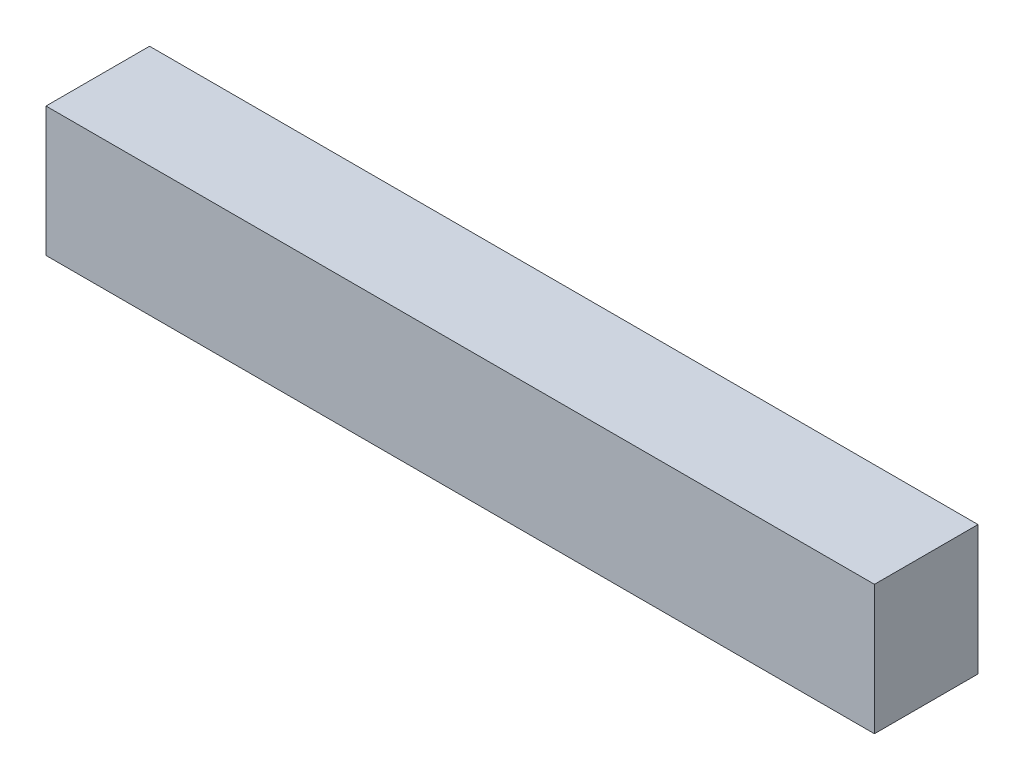
ISO-10303-21;
HEADER;
FILE_DESCRIPTION(('STEP AP214'),'2;1');
FILE_NAME('part.step','',(''),(''),'','','');
FILE_SCHEMA(('AUTOMOTIVE_DESIGN { 1 0 10303 214 1 1 1 1 }'));
ENDSEC;
DATA;
#1=APPLICATION_CONTEXT('core data for automotive mechanical design processes');
#2=APPLICATION_PROTOCOL_DEFINITION('international standard','automotive_design',2000,#1);
#3=PRODUCT_CONTEXT('',#1,'mechanical');
#4=PRODUCT('Part','Part','',(#3));
#5=PRODUCT_RELATED_PRODUCT_CATEGORY('part','',(#4));
#6=PRODUCT_DEFINITION_FORMATION('','',#4);
#7=PRODUCT_DEFINITION_CONTEXT('part definition',#1,'design');
#8=PRODUCT_DEFINITION('design','',#6,#7);
#9=PRODUCT_DEFINITION_SHAPE('','',#8);
#10=(LENGTH_UNIT() NAMED_UNIT(*) SI_UNIT(.MILLI.,.METRE.));
#11=(NAMED_UNIT(*) PLANE_ANGLE_UNIT() SI_UNIT($,.RADIAN.));
#12=(NAMED_UNIT(*) SI_UNIT($,.STERADIAN.) SOLID_ANGLE_UNIT());
#13=UNCERTAINTY_MEASURE_WITH_UNIT(LENGTH_MEASURE(1.E-05),#10,'distance_accuracy_value','');
#14=(GEOMETRIC_REPRESENTATION_CONTEXT(3) GLOBAL_UNCERTAINTY_ASSIGNED_CONTEXT((#13)) GLOBAL_UNIT_ASSIGNED_CONTEXT((#10,
#11,#12)) REPRESENTATION_CONTEXT('',''));
#15=CARTESIAN_POINT('',(0.,0.,0.));
#16=DIRECTION('',(0.,0.,1.));
#17=DIRECTION('',(1.,0.,0.));
#18=AXIS2_PLACEMENT_3D('',#15,#16,#17);
#19=CARTESIAN_POINT('',(16.,5.,2.));
#20=DIRECTION('',(-1.,0.,0.));
#21=DIRECTION('',(0.,0.,1.));
#22=AXIS2_PLACEMENT_3D('',#19,#20,#21);
#23=PLANE('',#22);
#24=DIRECTION('',(0.,0.,-1.));
#25=VECTOR('',#24,1.);
#26=CARTESIAN_POINT('',(16.,0.,2.));
#27=LINE('',#26,#25);
#28=CARTESIAN_POINT('',(16.,0.,2.));
#29=VERTEX_POINT('',#28);
#30=CARTESIAN_POINT('',(16.,0.,-2.));
#31=VERTEX_POINT('',#30);
#32=EDGE_CURVE('E96',#29,#31,#27,.T.);
#33=ORIENTED_EDGE('',*,*,#32,.T.);
#34=DIRECTION('',(0.,-1.,0.));
#35=VECTOR('',#34,1.);
#36=CARTESIAN_POINT('',(16.,5.,-2.));
#37=LINE('',#36,#35);
#38=CARTESIAN_POINT('',(16.,5.,-2.));
#39=VERTEX_POINT('',#38);
#40=EDGE_CURVE('E11',#39,#31,#37,.T.);
#41=ORIENTED_EDGE('',*,*,#40,.F.);
#42=DIRECTION('',(0.,0.,-1.));
#43=VECTOR('',#42,1.);
#44=CARTESIAN_POINT('',(16.,5.,2.));
#45=LINE('',#44,#43);
#46=CARTESIAN_POINT('',(16.,5.,2.));
#47=VERTEX_POINT('',#46);
#48=EDGE_CURVE('E84',#47,#39,#45,.T.);
#49=ORIENTED_EDGE('',*,*,#48,.F.);
#50=DIRECTION('',(0.,-1.,0.));
#51=VECTOR('',#50,1.);
#52=CARTESIAN_POINT('',(16.,5.,2.));
#53=LINE('',#52,#51);
#54=EDGE_CURVE('E92',#47,#29,#53,.T.);
#55=ORIENTED_EDGE('',*,*,#54,.T.);
#56=EDGE_LOOP('',(#33,#41,#49,#55));
#57=FACE_BOUND('',#56,.T.);
#58=ADVANCED_FACE('F33',(#57),#23,.F.);
#59=CARTESIAN_POINT('',(-16.,5.,-2.));
#60=DIRECTION('',(0.,0.,1.));
#61=DIRECTION('',(1.,0.,0.));
#62=AXIS2_PLACEMENT_3D('',#59,#60,#61);
#63=PLANE('',#62);
#64=DIRECTION('',(-1.,0.,0.));
#65=VECTOR('',#64,1.);
#66=CARTESIAN_POINT('',(-16.,0.,-2.));
#67=LINE('',#66,#65);
#68=CARTESIAN_POINT('',(-16.,0.,-2.));
#69=VERTEX_POINT('',#68);
#70=EDGE_CURVE('E88',#31,#69,#67,.T.);
#71=ORIENTED_EDGE('',*,*,#70,.T.);
#72=DIRECTION('',(0.,-1.,0.));
#73=VECTOR('',#72,1.);
#74=CARTESIAN_POINT('',(-16.,5.,-2.));
#75=LINE('',#74,#73);
#76=CARTESIAN_POINT('',(-16.,5.,-2.));
#77=VERTEX_POINT('',#76);
#78=EDGE_CURVE('E41',#77,#69,#75,.T.);
#79=ORIENTED_EDGE('',*,*,#78,.F.);
#80=DIRECTION('',(-1.,0.,0.));
#81=VECTOR('',#80,1.);
#82=CARTESIAN_POINT('',(-16.,5.,-2.));
#83=LINE('',#82,#81);
#84=EDGE_CURVE('E79',#39,#77,#83,.T.);
#85=ORIENTED_EDGE('',*,*,#84,.F.);
#86=ORIENTED_EDGE('',*,*,#40,.T.);
#87=EDGE_LOOP('',(#71,#79,#85,#86));
#88=FACE_BOUND('',#87,.T.);
#89=ADVANCED_FACE('F87',(#88),#63,.F.);
#90=CARTESIAN_POINT('',(-16.,5.,2.));
#91=DIRECTION('',(1.,0.,0.));
#92=DIRECTION('',(0.,0.,-1.));
#93=AXIS2_PLACEMENT_3D('',#90,#91,#92);
#94=PLANE('',#93);
#95=DIRECTION('',(0.,0.,1.));
#96=VECTOR('',#95,1.);
#97=CARTESIAN_POINT('',(-16.,0.,2.));
#98=LINE('',#97,#96);
#99=CARTESIAN_POINT('',(-16.,0.,2.));
#100=VERTEX_POINT('',#99);
#101=EDGE_CURVE('E66',#69,#100,#98,.T.);
#102=ORIENTED_EDGE('',*,*,#101,.T.);
#103=DIRECTION('',(0.,-1.,0.));
#104=VECTOR('',#103,1.);
#105=CARTESIAN_POINT('',(-16.,5.,2.));
#106=LINE('',#105,#104);
#107=CARTESIAN_POINT('',(-16.,5.,2.));
#108=VERTEX_POINT('',#107);
#109=EDGE_CURVE('E89',#108,#100,#106,.T.);
#110=ORIENTED_EDGE('',*,*,#109,.F.);
#111=DIRECTION('',(0.,0.,1.));
#112=VECTOR('',#111,1.);
#113=CARTESIAN_POINT('',(-16.,5.,2.));
#114=LINE('',#113,#112);
#115=EDGE_CURVE('E82',#77,#108,#114,.T.);
#116=ORIENTED_EDGE('',*,*,#115,.F.);
#117=ORIENTED_EDGE('',*,*,#78,.T.);
#118=EDGE_LOOP('',(#102,#110,#116,#117));
#119=FACE_BOUND('',#118,.T.);
#120=ADVANCED_FACE('F90',(#119),#94,.F.);
#121=CARTESIAN_POINT('',(-16.,5.,2.));
#122=DIRECTION('',(0.,0.,-1.));
#123=DIRECTION('',(-1.,0.,0.));
#124=AXIS2_PLACEMENT_3D('',#121,#122,#123);
#125=PLANE('',#124);
#126=DIRECTION('',(1.,0.,0.));
#127=VECTOR('',#126,1.);
#128=CARTESIAN_POINT('',(-16.,0.,2.));
#129=LINE('',#128,#127);
#130=EDGE_CURVE('E72',#100,#29,#129,.T.);
#131=ORIENTED_EDGE('',*,*,#130,.T.);
#132=ORIENTED_EDGE('',*,*,#54,.F.);
#133=DIRECTION('',(1.,0.,0.));
#134=VECTOR('',#133,1.);
#135=CARTESIAN_POINT('',(-16.,5.,2.));
#136=LINE('',#135,#134);
#137=EDGE_CURVE('E49',#108,#47,#136,.T.);
#138=ORIENTED_EDGE('',*,*,#137,.F.);
#139=ORIENTED_EDGE('',*,*,#109,.T.);
#140=EDGE_LOOP('',(#131,#132,#138,#139));
#141=FACE_BOUND('',#140,.T.);
#142=ADVANCED_FACE('F103',(#141),#125,.F.);
#143=CARTESIAN_POINT('',(0.,5.,0.));
#144=DIRECTION('',(0.,-1.,0.));
#145=DIRECTION('',(0.,0.,-1.));
#146=AXIS2_PLACEMENT_3D('',#143,#144,#145);
#147=PLANE('',#146);
#148=ORIENTED_EDGE('',*,*,#48,.T.);
#149=ORIENTED_EDGE('',*,*,#84,.T.);
#150=ORIENTED_EDGE('',*,*,#115,.T.);
#151=ORIENTED_EDGE('',*,*,#137,.T.);
#152=EDGE_LOOP('',(#148,#149,#150,#151));
#153=FACE_BOUND('',#152,.T.);
#154=ADVANCED_FACE('F80',(#153),#147,.F.);
#155=CARTESIAN_POINT('',(0.,0.,0.));
#156=DIRECTION('',(0.,-1.,0.));
#157=DIRECTION('',(0.,0.,-1.));
#158=AXIS2_PLACEMENT_3D('',#155,#156,#157);
#159=PLANE('',#158);
#160=ORIENTED_EDGE('',*,*,#32,.F.);
#161=ORIENTED_EDGE('',*,*,#130,.F.);
#162=ORIENTED_EDGE('',*,*,#101,.F.);
#163=ORIENTED_EDGE('',*,*,#70,.F.);
#164=EDGE_LOOP('',(#160,#161,#162,#163));
#165=FACE_BOUND('',#164,.T.);
#166=ADVANCED_FACE('F106',(#165),#159,.T.);
#167=CLOSED_SHELL('',(#58,#89,#120,#142,#154,#166));
#168=MANIFOLD_SOLID_BREP('B2',#167);
#169=ADVANCED_BREP_SHAPE_REPRESENTATION('',(#18,#168),#14);
#170=SHAPE_DEFINITION_REPRESENTATION(#9,#169);
ENDSEC;
END-ISO-10303-21;
